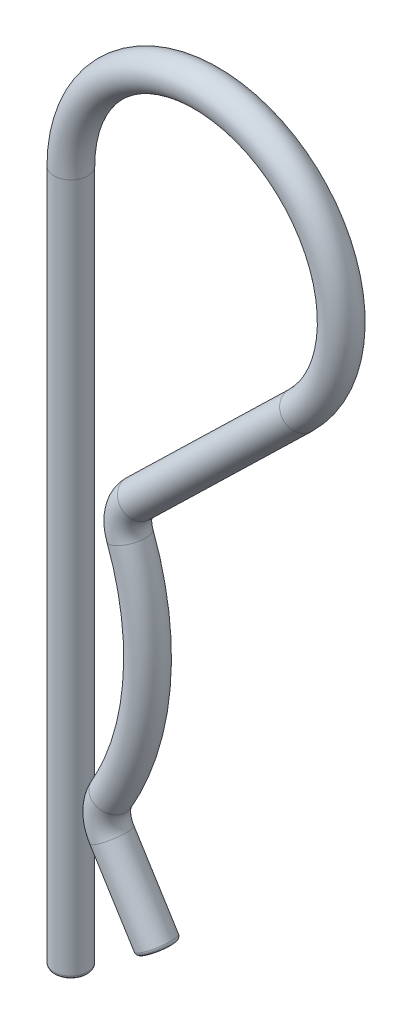
ISO-10303-21;
HEADER;
FILE_DESCRIPTION(('STEP AP214'),'2;1');
FILE_NAME('part.step','',(''),(''),'','','');
FILE_SCHEMA(('AUTOMOTIVE_DESIGN { 1 0 10303 214 1 1 1 1 }'));
ENDSEC;
DATA;
#1=APPLICATION_CONTEXT('core data for automotive mechanical design processes');
#2=APPLICATION_PROTOCOL_DEFINITION('international standard','automotive_design',2000,#1);
#3=PRODUCT_CONTEXT('',#1,'mechanical');
#4=PRODUCT('Part','Part','',(#3));
#5=PRODUCT_RELATED_PRODUCT_CATEGORY('part','',(#4));
#6=PRODUCT_DEFINITION_FORMATION('','',#4);
#7=PRODUCT_DEFINITION_CONTEXT('part definition',#1,'design');
#8=PRODUCT_DEFINITION('design','',#6,#7);
#9=PRODUCT_DEFINITION_SHAPE('','',#8);
#10=(LENGTH_UNIT() NAMED_UNIT(*) SI_UNIT(.MILLI.,.METRE.));
#11=(NAMED_UNIT(*) PLANE_ANGLE_UNIT() SI_UNIT($,.RADIAN.));
#12=(NAMED_UNIT(*) SI_UNIT($,.STERADIAN.) SOLID_ANGLE_UNIT());
#13=UNCERTAINTY_MEASURE_WITH_UNIT(LENGTH_MEASURE(1.E-05),#10,'distance_accuracy_value','');
#14=(GEOMETRIC_REPRESENTATION_CONTEXT(3) GLOBAL_UNCERTAINTY_ASSIGNED_CONTEXT((#13)) GLOBAL_UNIT_ASSIGNED_CONTEXT((#10,
#11,#12)) REPRESENTATION_CONTEXT('',''));
#15=CARTESIAN_POINT('',(0.,0.,0.));
#16=DIRECTION('',(0.,0.,1.));
#17=DIRECTION('',(1.,0.,0.));
#18=AXIS2_PLACEMENT_3D('',#15,#16,#17);
#19=CARTESIAN_POINT('',(-5.57540956985427,-33.0581085770051,0.));
#20=DIRECTION('',(0.529054288502506,-0.848587980009797,0.));
#21=DIRECTION('',(0.848587980009797,0.529054288502506,0.));
#22=AXIS2_PLACEMENT_3D('',#19,#20,#21);
#23=CYLINDRICAL_SURFACE('',#22,1.);
#24=CARTESIAN_POINT('',(-2.93551126648006,-37.2924301152209,0.));
#25=DIRECTION('',(-0.529054288502486,0.848587980009809,0.));
#26=DIRECTION('',(-0.848587980009809,-0.529054288502486,0.));
#27=AXIS2_PLACEMENT_3D('',#24,#25,#26);
#28=CIRCLE('',#27,1.);
#29=CARTESIAN_POINT('',(-3.78409924648987,-37.8214844037234,0.));
#30=VERTEX_POINT('',#29);
#31=EDGE_CURVE('E47',#30,#30,#28,.T.);
#32=ORIENTED_EDGE('',*,*,#31,.T.);
#33=EDGE_LOOP('',(#32));
#34=FACE_BOUND('',#33,.T.);
#35=CARTESIAN_POINT('',(-5.57540956985427,-33.0581085770051,0.));
#36=DIRECTION('',(-0.529054288502486,0.848587980009809,0.));
#37=DIRECTION('',(-0.848587980009809,-0.529054288502486,0.));
#38=AXIS2_PLACEMENT_3D('',#35,#36,#37);
#39=CIRCLE('',#38,1.);
#40=CARTESIAN_POINT('',(-6.42399754986403,-33.5871628655077,0.));
#41=VERTEX_POINT('',#40);
#42=EDGE_CURVE('E52',#41,#41,#39,.T.);
#43=ORIENTED_EDGE('',*,*,#42,.F.);
#44=EDGE_LOOP('',(#43));
#45=FACE_BOUND('',#44,.T.);
#46=ADVANCED_FACE('F32',(#34,#45),#23,.T.);
#47=CARTESIAN_POINT('',(-3.87823360983472,-32.,0.));
#48=DIRECTION('',(0.,0.,1.));
#49=DIRECTION('',(1.,0.,0.));
#50=AXIS2_PLACEMENT_3D('',#47,#48,#49);
#51=TOROIDAL_SURFACE('',#50,2.00000000000001,1.);
#52=CARTESIAN_POINT('',(-5.6135845893849,-31.0057379732816,0.));
#53=DIRECTION('',(0.497131013359289,0.867675489775046,0.));
#54=DIRECTION('',(-0.867675489775046,0.497131013359289,0.));
#55=AXIS2_PLACEMENT_3D('',#52,#53,#54);
#56=CIRCLE('',#55,1.);
#57=CARTESIAN_POINT('',(-6.48126007915998,-30.5086069599223,0.));
#58=VERTEX_POINT('',#57);
#59=EDGE_CURVE('E55',#58,#58,#56,.T.);
#60=CARTESIAN_POINT('',(-3.87823360983472,-32.,0.));
#61=DIRECTION('',(0.,0.,1.));
#62=DIRECTION('',(1.,0.,0.));
#63=AXIS2_PLACEMENT_3D('',#60,#61,#62);
#64=CIRCLE('',#63,3.00000000000001);
#65=EDGE_CURVE('',#58,#41,#64,.T.);
#66=ORIENTED_EDGE('',*,*,#59,.F.);
#67=ORIENTED_EDGE('',*,*,#42,.T.);
#68=ORIENTED_EDGE('',*,*,#65,.T.);
#69=ORIENTED_EDGE('',*,*,#65,.F.);
#70=EDGE_LOOP('',(#66,#68,#67,#69));
#71=FACE_BOUND('',#70,.T.);
#72=ADVANCED_FACE('F94',(#71),#51,.T.);
#73=CARTESIAN_POINT('',(-19.7252487398184,-22.9205194993684,0.));
#74=DIRECTION('',(0.,0.,-1.));
#75=DIRECTION('',(-1.,0.,0.));
#76=AXIS2_PLACEMENT_3D('',#73,#74,#75);
#77=TOROIDAL_SURFACE('',#76,16.263757956436,1.);
#78=CARTESIAN_POINT('',(-4.50343328274368,-17.19285356495,0.));
#79=DIRECTION('',(-0.352173584343814,0.935934702044128,0.));
#80=DIRECTION('',(-0.935934702044128,-0.352173584343814,0.));
#81=AXIS2_PLACEMENT_3D('',#78,#79,#80);
#82=CIRCLE('',#81,1.);
#83=CARTESIAN_POINT('',(-5.43936798478778,-17.5450271492939,0.));
#84=VERTEX_POINT('',#83);
#85=EDGE_CURVE('E58',#84,#84,#82,.T.);
#86=ORIENTED_EDGE('',*,*,#85,.F.);
#87=EDGE_LOOP('',(#86));
#88=FACE_BOUND('',#87,.T.);
#89=ORIENTED_EDGE('',*,*,#59,.T.);
#90=EDGE_LOOP('',(#89));
#91=FACE_BOUND('',#90,.T.);
#92=ADVANCED_FACE('F88',(#88,#91),#77,.T.);
#93=CARTESIAN_POINT('',(-2.63156387865546,-16.4885063962622,0.));
#94=DIRECTION('',(0.,0.,1.));
#95=DIRECTION('',(1.,0.,0.));
#96=AXIS2_PLACEMENT_3D('',#93,#94,#95);
#97=TOROIDAL_SURFACE('',#96,2.00000000000001,1.);
#98=CARTESIAN_POINT('',(-4.02440884522138,-15.0532423442105,0.));
#99=DIRECTION('',(0.717632026025922,0.696422483282907,0.));
#100=DIRECTION('',(-0.696422483282907,0.717632026025922,0.));
#101=AXIS2_PLACEMENT_3D('',#98,#99,#100);
#102=CIRCLE('',#101,1.);
#103=CARTESIAN_POINT('',(-4.72083132850434,-14.3356103181846,0.));
#104=VERTEX_POINT('',#103);
#105=EDGE_CURVE('E61',#104,#104,#102,.T.);
#106=CARTESIAN_POINT('',(-2.63156387865546,-16.4885063962622,0.));
#107=DIRECTION('',(0.,0.,1.));
#108=DIRECTION('',(1.,0.,0.));
#109=AXIS2_PLACEMENT_3D('',#106,#107,#108);
#110=CIRCLE('',#109,3.00000000000001);
#111=EDGE_CURVE('',#104,#84,#110,.T.);
#112=ORIENTED_EDGE('',*,*,#105,.F.);
#113=ORIENTED_EDGE('',*,*,#85,.T.);
#114=ORIENTED_EDGE('',*,*,#111,.T.);
#115=ORIENTED_EDGE('',*,*,#111,.F.);
#116=EDGE_LOOP('',(#112,#114,#113,#115));
#117=FACE_BOUND('',#116,.T.);
#118=ADVANCED_FACE('F82',(#117),#97,.T.);
#119=CARTESIAN_POINT('',(5.57137986626326,-5.74105620820737,0.));
#120=DIRECTION('',(-0.717632026025912,-0.696422483282917,0.));
#121=DIRECTION('',(0.696422483282917,-0.717632026025912,0.));
#122=AXIS2_PLACEMENT_3D('',#119,#120,#121);
#123=CYLINDRICAL_SURFACE('',#122,1.);
#124=CARTESIAN_POINT('',(5.57137986626326,-5.74105620820737,0.));
#125=DIRECTION('',(0.717632026025922,0.696422483282907,0.));
#126=DIRECTION('',(-0.696422483282907,0.717632026025922,0.));
#127=AXIS2_PLACEMENT_3D('',#124,#125,#126);
#128=CIRCLE('',#127,1.);
#129=CARTESIAN_POINT('',(6.26780234954616,-6.45868823423329,0.));
#130=VERTEX_POINT('',#129);
#131=EDGE_CURVE('E64',#130,#130,#128,.T.);
#132=ORIENTED_EDGE('',*,*,#131,.F.);
#133=EDGE_LOOP('',(#132));
#134=FACE_BOUND('',#133,.T.);
#135=ORIENTED_EDGE('',*,*,#105,.T.);
#136=EDGE_LOOP('',(#135));
#137=FACE_BOUND('',#136,.T.);
#138=ADVANCED_FACE('F76',(#134,#137),#123,.T.);
#139=CARTESIAN_POINT('',(0.,0.,0.));
#140=DIRECTION('',(0.,0.,-1.));
#141=DIRECTION('',(-1.,0.,0.));
#142=AXIS2_PLACEMENT_3D('',#139,#140,#141);
#143=TOROIDAL_SURFACE('',#142,8.,1.);
#144=CARTESIAN_POINT('',(-8.,0.,0.));
#145=DIRECTION('',(0.,-1.,0.));
#146=DIRECTION('',(1.,0.,0.));
#147=AXIS2_PLACEMENT_3D('',#144,#145,#146);
#148=CIRCLE('',#147,1.);
#149=CARTESIAN_POINT('',(-9.,0.,0.));
#150=VERTEX_POINT('',#149);
#151=EDGE_CURVE('E67',#150,#150,#148,.T.);
#152=CARTESIAN_POINT('',(0.,0.,0.));
#153=DIRECTION('',(0.,0.,-1.));
#154=DIRECTION('',(-1.,0.,0.));
#155=AXIS2_PLACEMENT_3D('',#152,#153,#154);
#156=CIRCLE('',#155,9.);
#157=EDGE_CURVE('',#150,#130,#156,.T.);
#158=ORIENTED_EDGE('',*,*,#151,.F.);
#159=ORIENTED_EDGE('',*,*,#131,.T.);
#160=ORIENTED_EDGE('',*,*,#157,.T.);
#161=ORIENTED_EDGE('',*,*,#157,.F.);
#162=EDGE_LOOP('',(#158,#160,#159,#161));
#163=FACE_BOUND('',#162,.T.);
#164=ADVANCED_FACE('F73',(#163),#143,.T.);
#165=CARTESIAN_POINT('',(-8.,0.,0.));
#166=DIRECTION('',(0.,-1.,0.));
#167=DIRECTION('',(1.,0.,0.));
#168=AXIS2_PLACEMENT_3D('',#165,#166,#167);
#169=CYLINDRICAL_SURFACE('',#168,1.);
#170=CARTESIAN_POINT('',(-7.99999999999999,-40.8,0.));
#171=DIRECTION('',(0.,-1.,0.));
#172=DIRECTION('',(1.,0.,0.));
#173=AXIS2_PLACEMENT_3D('',#170,#171,#172);
#174=CIRCLE('',#173,1.);
#175=CARTESIAN_POINT('',(-6.99999999999999,-40.8,0.));
#176=VERTEX_POINT('',#175);
#177=EDGE_CURVE('E10',#176,#176,#174,.F.);
#178=ORIENTED_EDGE('',*,*,#177,.T.);
#179=EDGE_LOOP('',(#178));
#180=FACE_BOUND('',#179,.T.);
#181=ORIENTED_EDGE('',*,*,#151,.T.);
#182=EDGE_LOOP('',(#181));
#183=FACE_BOUND('',#182,.T.);
#184=ADVANCED_FACE('F71',(#180,#183),#169,.T.);
#185=CARTESIAN_POINT('',(-2.82970040877956,-37.4621477112229,0.));
#186=DIRECTION('',(-0.529054288502486,0.848587980009809,0.));
#187=DIRECTION('',(-0.848587980009809,-0.529054288502486,0.));
#188=AXIS2_PLACEMENT_3D('',#185,#186,#187);
#189=PLANE('',#188);
#190=CARTESIAN_POINT('',(-2.82970040877956,-37.4621477112229,0.));
#191=DIRECTION('',(-0.529054288502486,0.848587980009809,0.));
#192=DIRECTION('',(-0.848587980009809,-0.529054288502486,0.));
#193=AXIS2_PLACEMENT_3D('',#190,#191,#192);
#194=CIRCLE('',#193,0.8);
#195=CARTESIAN_POINT('',(-3.50857079278741,-37.8853911420249,0.));
#196=VERTEX_POINT('',#195);
#197=EDGE_CURVE('E43',#196,#196,#194,.F.);
#198=ORIENTED_EDGE('',*,*,#197,.T.);
#199=EDGE_LOOP('',(#198));
#200=FACE_BOUND('',#199,.T.);
#201=ADVANCED_FACE('F120',(#200),#189,.F.);
#202=CARTESIAN_POINT('',(-7.99999999999999,-41.,0.));
#203=DIRECTION('',(0.,-1.,0.));
#204=DIRECTION('',(1.,0.,0.));
#205=AXIS2_PLACEMENT_3D('',#202,#203,#204);
#206=PLANE('',#205);
#207=CARTESIAN_POINT('',(-7.99999999999999,-41.,0.));
#208=DIRECTION('',(0.,-1.,0.));
#209=DIRECTION('',(1.,0.,0.));
#210=AXIS2_PLACEMENT_3D('',#207,#208,#209);
#211=CIRCLE('',#210,0.8);
#212=CARTESIAN_POINT('',(-7.2,-41.,0.));
#213=VERTEX_POINT('',#212);
#214=EDGE_CURVE('E39',#213,#213,#211,.T.);
#215=ORIENTED_EDGE('',*,*,#214,.T.);
#216=EDGE_LOOP('',(#215));
#217=FACE_BOUND('',#216,.T.);
#218=ADVANCED_FACE('F112',(#217),#206,.T.);
#219=CARTESIAN_POINT('',(-2.93551126648006,-37.2924301152209,0.));
#220=DIRECTION('',(-0.529054288502486,0.848587980009809,0.));
#221=DIRECTION('',(-0.848587980009809,-0.529054288502486,0.));
#222=AXIS2_PLACEMENT_3D('',#219,#220,#221);
#223=TOROIDAL_SURFACE('',#222,0.8,0.2);
#224=ORIENTED_EDGE('',*,*,#197,.F.);
#225=EDGE_LOOP('',(#224));
#226=FACE_BOUND('',#225,.T.);
#227=ORIENTED_EDGE('',*,*,#31,.F.);
#228=EDGE_LOOP('',(#227));
#229=FACE_BOUND('',#228,.T.);
#230=ADVANCED_FACE('F110',(#226,#229),#223,.T.);
#231=CARTESIAN_POINT('',(-7.99999999999999,-40.8,0.));
#232=DIRECTION('',(0.,-1.,0.));
#233=DIRECTION('',(1.,0.,0.));
#234=AXIS2_PLACEMENT_3D('',#231,#232,#233);
#235=TOROIDAL_SURFACE('',#234,0.8,0.2);
#236=ORIENTED_EDGE('',*,*,#177,.F.);
#237=EDGE_LOOP('',(#236));
#238=FACE_BOUND('',#237,.T.);
#239=ORIENTED_EDGE('',*,*,#214,.F.);
#240=EDGE_LOOP('',(#239));
#241=FACE_BOUND('',#240,.T.);
#242=ADVANCED_FACE('F34',(#238,#241),#235,.T.);
#243=CLOSED_SHELL('',(#46,#72,#92,#118,#138,#164,#184,#201,#218,#230,#242));
#244=MANIFOLD_SOLID_BREP('B2',#243);
#245=ADVANCED_BREP_SHAPE_REPRESENTATION('',(#18,#244),#14);
#246=SHAPE_DEFINITION_REPRESENTATION(#9,#245);
ENDSEC;
END-ISO-10303-21;
